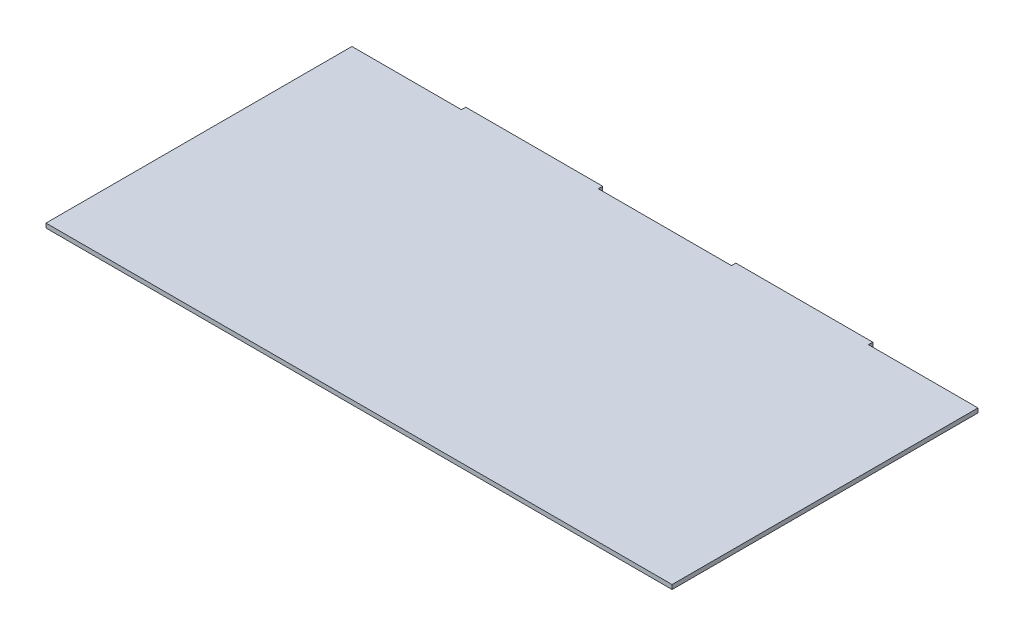
ISO-10303-21;
HEADER;
FILE_DESCRIPTION(('STEP AP214'),'2;1');
FILE_NAME('part.step','',(''),(''),'','','');
FILE_SCHEMA(('AUTOMOTIVE_DESIGN { 1 0 10303 214 1 1 1 1 }'));
ENDSEC;
DATA;
#1=APPLICATION_CONTEXT('core data for automotive mechanical design processes');
#2=APPLICATION_PROTOCOL_DEFINITION('international standard','automotive_design',2000,#1);
#3=PRODUCT_CONTEXT('',#1,'mechanical');
#4=PRODUCT('Part','Part','',(#3));
#5=PRODUCT_RELATED_PRODUCT_CATEGORY('part','',(#4));
#6=PRODUCT_DEFINITION_FORMATION('','',#4);
#7=PRODUCT_DEFINITION_CONTEXT('part definition',#1,'design');
#8=PRODUCT_DEFINITION('design','',#6,#7);
#9=PRODUCT_DEFINITION_SHAPE('','',#8);
#10=(LENGTH_UNIT() NAMED_UNIT(*) SI_UNIT(.MILLI.,.METRE.));
#11=(NAMED_UNIT(*) PLANE_ANGLE_UNIT() SI_UNIT($,.RADIAN.));
#12=(NAMED_UNIT(*) SI_UNIT($,.STERADIAN.) SOLID_ANGLE_UNIT());
#13=UNCERTAINTY_MEASURE_WITH_UNIT(LENGTH_MEASURE(1.E-05),#10,'distance_accuracy_value','');
#14=(GEOMETRIC_REPRESENTATION_CONTEXT(3) GLOBAL_UNCERTAINTY_ASSIGNED_CONTEXT((#13)) GLOBAL_UNIT_ASSIGNED_CONTEXT((#10,
#11,#12)) REPRESENTATION_CONTEXT('',''));
#15=CARTESIAN_POINT('',(0.,0.,0.));
#16=DIRECTION('',(0.,0.,1.));
#17=DIRECTION('',(1.,0.,0.));
#18=AXIS2_PLACEMENT_3D('',#15,#16,#17);
#19=CARTESIAN_POINT('',(0.,0.,0.));
#20=DIRECTION('',(0.,0.,-1.));
#21=DIRECTION('',(-1.,0.,0.));
#22=AXIS2_PLACEMENT_3D('',#19,#20,#21);
#23=PLANE('',#22);
#24=DIRECTION('',(1.,0.,0.));
#25=VECTOR('',#24,1.);
#26=CARTESIAN_POINT('',(-228.6,-1.5875,0.));
#27=LINE('',#26,#25);
#28=CARTESIAN_POINT('',(-48.623,-1.58749999999999,0.));
#29=VERTEX_POINT('',#28);
#30=CARTESIAN_POINT('',(48.5999999999999,-1.5875,0.));
#31=VERTEX_POINT('',#30);
#32=EDGE_CURVE('E147',#29,#31,#27,.T.);
#33=ORIENTED_EDGE('',*,*,#32,.F.);
#34=DIRECTION('',(0.,-1.,0.));
#35=VECTOR('',#34,1.);
#36=CARTESIAN_POINT('',(-48.623,1.58750000000005,0.));
#37=LINE('',#36,#35);
#38=CARTESIAN_POINT('',(-48.623,1.58750000000005,0.));
#39=VERTEX_POINT('',#38);
#40=EDGE_CURVE('E136',#39,#29,#37,.T.);
#41=ORIENTED_EDGE('',*,*,#40,.F.);
#42=DIRECTION('',(-1.,0.,0.));
#43=VECTOR('',#42,1.);
#44=CARTESIAN_POINT('',(-228.6,1.5875,0.));
#45=LINE('',#44,#43);
#46=CARTESIAN_POINT('',(48.6,1.58750000000005,0.));
#47=VERTEX_POINT('',#46);
#48=EDGE_CURVE('E145',#47,#39,#45,.T.);
#49=ORIENTED_EDGE('',*,*,#48,.F.);
#50=DIRECTION('',(0.,1.,0.));
#51=VECTOR('',#50,1.);
#52=CARTESIAN_POINT('',(48.6,1.58750000000005,0.));
#53=LINE('',#52,#51);
#54=EDGE_CURVE('E214',#31,#47,#53,.T.);
#55=ORIENTED_EDGE('',*,*,#54,.F.);
#56=EDGE_LOOP('',(#33,#41,#49,#55));
#57=FACE_BOUND('',#56,.T.);
#58=ADVANCED_FACE('F41',(#57),#23,.T.);
#59=CARTESIAN_POINT('',(-148.623,1.5875,0.));
#60=VERTEX_POINT('',#59);
#61=CARTESIAN_POINT('',(-228.6,1.5875,0.));
#62=VERTEX_POINT('',#61);
#63=EDGE_CURVE('E156',#60,#62,#45,.T.);
#64=ORIENTED_EDGE('',*,*,#63,.F.);
#65=DIRECTION('',(0.,1.,0.));
#66=VECTOR('',#65,1.);
#67=CARTESIAN_POINT('',(-148.623,1.58750000000005,0.));
#68=LINE('',#67,#66);
#69=CARTESIAN_POINT('',(-148.623,-1.58749999999999,0.));
#70=VERTEX_POINT('',#69);
#71=EDGE_CURVE('E148',#70,#60,#68,.T.);
#72=ORIENTED_EDGE('',*,*,#71,.F.);
#73=CARTESIAN_POINT('',(-228.6,-1.5875,0.));
#74=VERTEX_POINT('',#73);
#75=EDGE_CURVE('E165',#74,#70,#27,.T.);
#76=ORIENTED_EDGE('',*,*,#75,.F.);
#77=DIRECTION('',(0.,-1.,0.));
#78=VECTOR('',#77,1.);
#79=CARTESIAN_POINT('',(-228.6,-1.5875,0.));
#80=LINE('',#79,#78);
#81=EDGE_CURVE('E158',#62,#74,#80,.T.);
#82=ORIENTED_EDGE('',*,*,#81,.F.);
#83=EDGE_LOOP('',(#64,#72,#76,#82));
#84=FACE_BOUND('',#83,.T.);
#85=ADVANCED_FACE('F186',(#84),#23,.T.);
#86=DIRECTION('',(0.,-1.,0.));
#87=VECTOR('',#86,1.);
#88=CARTESIAN_POINT('',(148.6,1.58750000000005,0.));
#89=LINE('',#88,#87);
#90=CARTESIAN_POINT('',(148.6,1.5875,0.));
#91=VERTEX_POINT('',#90);
#92=CARTESIAN_POINT('',(148.6,-1.5875,0.));
#93=VERTEX_POINT('',#92);
#94=EDGE_CURVE('E64',#91,#93,#89,.T.);
#95=ORIENTED_EDGE('',*,*,#94,.F.);
#96=CARTESIAN_POINT('',(228.6,1.5875,0.));
#97=VERTEX_POINT('',#96);
#98=EDGE_CURVE('E155',#97,#91,#45,.T.);
#99=ORIENTED_EDGE('',*,*,#98,.F.);
#100=DIRECTION('',(0.,1.,0.));
#101=VECTOR('',#100,1.);
#102=CARTESIAN_POINT('',(228.6,-1.5875,0.));
#103=LINE('',#102,#101);
#104=CARTESIAN_POINT('',(228.6,-1.5875,0.));
#105=VERTEX_POINT('',#104);
#106=EDGE_CURVE('E159',#105,#97,#103,.T.);
#107=ORIENTED_EDGE('',*,*,#106,.F.);
#108=EDGE_CURVE('E164',#93,#105,#27,.T.);
#109=ORIENTED_EDGE('',*,*,#108,.F.);
#110=EDGE_LOOP('',(#95,#99,#107,#109));
#111=FACE_BOUND('',#110,.T.);
#112=ADVANCED_FACE('F251',(#111),#23,.T.);
#113=CARTESIAN_POINT('',(228.6,-1.5875,223.380000026));
#114=DIRECTION('',(-1.,0.,0.));
#115=DIRECTION('',(0.,0.,1.));
#116=AXIS2_PLACEMENT_3D('',#113,#114,#115);
#117=PLANE('',#116);
#118=ORIENTED_EDGE('',*,*,#106,.T.);
#119=DIRECTION('',(0.,0.,-1.));
#120=VECTOR('',#119,1.);
#121=CARTESIAN_POINT('',(228.6,1.5875,223.380000026));
#122=LINE('',#121,#120);
#123=CARTESIAN_POINT('',(228.6,1.5875,223.380000026));
#124=VERTEX_POINT('',#123);
#125=EDGE_CURVE('E11',#124,#97,#122,.T.);
#126=ORIENTED_EDGE('',*,*,#125,.F.);
#127=DIRECTION('',(0.,1.,0.));
#128=VECTOR('',#127,1.);
#129=CARTESIAN_POINT('',(228.6,-1.5875,223.380000026));
#130=LINE('',#129,#128);
#131=CARTESIAN_POINT('',(228.6,-1.5875,223.380000026));
#132=VERTEX_POINT('',#131);
#133=EDGE_CURVE('E168',#132,#124,#130,.T.);
#134=ORIENTED_EDGE('',*,*,#133,.F.);
#135=DIRECTION('',(0.,0.,-1.));
#136=VECTOR('',#135,1.);
#137=CARTESIAN_POINT('',(228.6,-1.5875,223.380000026));
#138=LINE('',#137,#136);
#139=EDGE_CURVE('E169',#132,#105,#138,.T.);
#140=ORIENTED_EDGE('',*,*,#139,.T.);
#141=EDGE_LOOP('',(#118,#126,#134,#140));
#142=FACE_BOUND('',#141,.T.);
#143=ADVANCED_FACE('F43',(#142),#117,.F.);
#144=CARTESIAN_POINT('',(-228.6,1.5875,223.380000026));
#145=DIRECTION('',(0.,-1.,0.));
#146=DIRECTION('',(0.,0.,-1.));
#147=AXIS2_PLACEMENT_3D('',#144,#145,#146);
#148=PLANE('',#147);
#149=ORIENTED_EDGE('',*,*,#98,.T.);
#150=DIRECTION('',(0.,0.,1.));
#151=VECTOR('',#150,1.);
#152=CARTESIAN_POINT('',(148.6,1.58750000000005,-3.175));
#153=LINE('',#152,#151);
#154=CARTESIAN_POINT('',(148.6,1.58750000000005,-3.175));
#155=VERTEX_POINT('',#154);
#156=EDGE_CURVE('E210',#155,#91,#153,.T.);
#157=ORIENTED_EDGE('',*,*,#156,.F.);
#158=DIRECTION('',(1.,0.,0.));
#159=VECTOR('',#158,1.);
#160=CARTESIAN_POINT('',(148.6,1.58750000000005,-3.175));
#161=LINE('',#160,#159);
#162=CARTESIAN_POINT('',(48.6,1.58750000000005,-3.175));
#163=VERTEX_POINT('',#162);
#164=EDGE_CURVE('E213',#163,#155,#161,.T.);
#165=ORIENTED_EDGE('',*,*,#164,.F.);
#166=DIRECTION('',(0.,0.,1.));
#167=VECTOR('',#166,1.);
#168=CARTESIAN_POINT('',(48.6,1.58750000000005,-3.175));
#169=LINE('',#168,#167);
#170=EDGE_CURVE('E154',#163,#47,#169,.T.);
#171=ORIENTED_EDGE('',*,*,#170,.T.);
#172=ORIENTED_EDGE('',*,*,#48,.T.);
#173=DIRECTION('',(0.,0.,1.));
#174=VECTOR('',#173,1.);
#175=CARTESIAN_POINT('',(-48.623,1.58750000000005,-3.175));
#176=LINE('',#175,#174);
#177=CARTESIAN_POINT('',(-48.623,1.58750000000005,-3.175));
#178=VERTEX_POINT('',#177);
#179=EDGE_CURVE('E132',#178,#39,#176,.T.);
#180=ORIENTED_EDGE('',*,*,#179,.F.);
#181=DIRECTION('',(1.,0.,0.));
#182=VECTOR('',#181,1.);
#183=CARTESIAN_POINT('',(-48.623,1.58750000000005,-3.175));
#184=LINE('',#183,#182);
#185=CARTESIAN_POINT('',(-148.623,1.58750000000005,-3.175));
#186=VERTEX_POINT('',#185);
#187=EDGE_CURVE('E141',#186,#178,#184,.T.);
#188=ORIENTED_EDGE('',*,*,#187,.F.);
#189=DIRECTION('',(0.,0.,1.));
#190=VECTOR('',#189,1.);
#191=CARTESIAN_POINT('',(-148.623,1.58750000000005,-3.175));
#192=LINE('',#191,#190);
#193=EDGE_CURVE('E56',#186,#60,#192,.T.);
#194=ORIENTED_EDGE('',*,*,#193,.T.);
#195=ORIENTED_EDGE('',*,*,#63,.T.);
#196=DIRECTION('',(0.,0.,-1.));
#197=VECTOR('',#196,1.);
#198=CARTESIAN_POINT('',(-228.6,1.5875,223.380000026));
#199=LINE('',#198,#197);
#200=CARTESIAN_POINT('',(-228.6,1.5875,223.380000026));
#201=VERTEX_POINT('',#200);
#202=EDGE_CURVE('E49',#201,#62,#199,.T.);
#203=ORIENTED_EDGE('',*,*,#202,.F.);
#204=DIRECTION('',(-1.,0.,0.));
#205=VECTOR('',#204,1.);
#206=CARTESIAN_POINT('',(-228.6,1.5875,223.380000026));
#207=LINE('',#206,#205);
#208=EDGE_CURVE('E198',#124,#201,#207,.T.);
#209=ORIENTED_EDGE('',*,*,#208,.F.);
#210=ORIENTED_EDGE('',*,*,#125,.T.);
#211=EDGE_LOOP('',(#149,#157,#165,#171,#172,#180,#188,#194,#195,#203,#209,#210));
#212=FACE_BOUND('',#211,.T.);
#213=ADVANCED_FACE('F151',(#212),#148,.F.);
#214=CARTESIAN_POINT('',(-228.6,-1.5875,223.380000026));
#215=DIRECTION('',(1.,0.,0.));
#216=DIRECTION('',(0.,0.,-1.));
#217=AXIS2_PLACEMENT_3D('',#214,#215,#216);
#218=PLANE('',#217);
#219=ORIENTED_EDGE('',*,*,#81,.T.);
#220=DIRECTION('',(0.,0.,-1.));
#221=VECTOR('',#220,1.);
#222=CARTESIAN_POINT('',(-228.6,-1.5875,223.380000026));
#223=LINE('',#222,#221);
#224=CARTESIAN_POINT('',(-228.6,-1.5875,223.380000026));
#225=VERTEX_POINT('',#224);
#226=EDGE_CURVE('E172',#225,#74,#223,.T.);
#227=ORIENTED_EDGE('',*,*,#226,.F.);
#228=DIRECTION('',(0.,-1.,0.));
#229=VECTOR('',#228,1.);
#230=CARTESIAN_POINT('',(-228.6,-1.5875,223.380000026));
#231=LINE('',#230,#229);
#232=EDGE_CURVE('E182',#201,#225,#231,.T.);
#233=ORIENTED_EDGE('',*,*,#232,.F.);
#234=ORIENTED_EDGE('',*,*,#202,.T.);
#235=EDGE_LOOP('',(#219,#227,#233,#234));
#236=FACE_BOUND('',#235,.T.);
#237=ADVANCED_FACE('F180',(#236),#218,.F.);
#238=CARTESIAN_POINT('',(-228.6,-1.5875,223.380000026));
#239=DIRECTION('',(0.,1.,0.));
#240=DIRECTION('',(0.,0.,1.));
#241=AXIS2_PLACEMENT_3D('',#238,#239,#240);
#242=PLANE('',#241);
#243=ORIENTED_EDGE('',*,*,#75,.T.);
#244=DIRECTION('',(0.,0.,1.));
#245=VECTOR('',#244,1.);
#246=CARTESIAN_POINT('',(-148.623,-1.58749999999999,-3.175));
#247=LINE('',#246,#245);
#248=CARTESIAN_POINT('',(-148.623,-1.58749999999999,-3.175));
#249=VERTEX_POINT('',#248);
#250=EDGE_CURVE('E191',#249,#70,#247,.T.);
#251=ORIENTED_EDGE('',*,*,#250,.F.);
#252=DIRECTION('',(-1.,0.,0.));
#253=VECTOR('',#252,1.);
#254=CARTESIAN_POINT('',(-48.623,-1.58749999999999,-3.175));
#255=LINE('',#254,#253);
#256=CARTESIAN_POINT('',(-48.623,-1.58749999999999,-3.175));
#257=VERTEX_POINT('',#256);
#258=EDGE_CURVE('E226',#257,#249,#255,.T.);
#259=ORIENTED_EDGE('',*,*,#258,.F.);
#260=DIRECTION('',(0.,0.,1.));
#261=VECTOR('',#260,1.);
#262=CARTESIAN_POINT('',(-48.623,-1.58749999999999,-3.175));
#263=LINE('',#262,#261);
#264=EDGE_CURVE('E234',#257,#29,#263,.T.);
#265=ORIENTED_EDGE('',*,*,#264,.T.);
#266=ORIENTED_EDGE('',*,*,#32,.T.);
#267=DIRECTION('',(0.,0.,1.));
#268=VECTOR('',#267,1.);
#269=CARTESIAN_POINT('',(48.6,-1.58749999999999,-3.175));
#270=LINE('',#269,#268);
#271=CARTESIAN_POINT('',(48.6,-1.58749999999999,-3.175));
#272=VERTEX_POINT('',#271);
#273=EDGE_CURVE('E206',#272,#31,#270,.T.);
#274=ORIENTED_EDGE('',*,*,#273,.F.);
#275=DIRECTION('',(-1.,0.,0.));
#276=VECTOR('',#275,1.);
#277=CARTESIAN_POINT('',(148.6,-1.58749999999999,-3.175));
#278=LINE('',#277,#276);
#279=CARTESIAN_POINT('',(148.6,-1.58749999999999,-3.175));
#280=VERTEX_POINT('',#279);
#281=EDGE_CURVE('E221',#280,#272,#278,.T.);
#282=ORIENTED_EDGE('',*,*,#281,.F.);
#283=DIRECTION('',(0.,0.,1.));
#284=VECTOR('',#283,1.);
#285=CARTESIAN_POINT('',(148.6,-1.58749999999999,-3.175));
#286=LINE('',#285,#284);
#287=EDGE_CURVE('E203',#280,#93,#286,.T.);
#288=ORIENTED_EDGE('',*,*,#287,.T.);
#289=ORIENTED_EDGE('',*,*,#108,.T.);
#290=ORIENTED_EDGE('',*,*,#139,.F.);
#291=DIRECTION('',(1.,0.,0.));
#292=VECTOR('',#291,1.);
#293=CARTESIAN_POINT('',(-228.6,-1.5875,223.380000026));
#294=LINE('',#293,#292);
#295=EDGE_CURVE('E173',#225,#132,#294,.T.);
#296=ORIENTED_EDGE('',*,*,#295,.F.);
#297=ORIENTED_EDGE('',*,*,#226,.T.);
#298=EDGE_LOOP('',(#243,#251,#259,#265,#266,#274,#282,#288,#289,#290,#296,#297));
#299=FACE_BOUND('',#298,.T.);
#300=ADVANCED_FACE('F190',(#299),#242,.F.);
#301=CARTESIAN_POINT('',(0.,0.,223.380000026));
#302=DIRECTION('',(0.,0.,-1.));
#303=DIRECTION('',(-1.,0.,0.));
#304=AXIS2_PLACEMENT_3D('',#301,#302,#303);
#305=PLANE('',#304);
#306=ORIENTED_EDGE('',*,*,#133,.T.);
#307=ORIENTED_EDGE('',*,*,#208,.T.);
#308=ORIENTED_EDGE('',*,*,#232,.T.);
#309=ORIENTED_EDGE('',*,*,#295,.T.);
#310=EDGE_LOOP('',(#306,#307,#308,#309));
#311=FACE_BOUND('',#310,.T.);
#312=ADVANCED_FACE('F271',(#311),#305,.F.);
#313=CARTESIAN_POINT('',(148.6,1.58750000000005,-3.175));
#314=DIRECTION('',(-1.,0.,0.));
#315=DIRECTION('',(0.,0.,1.));
#316=AXIS2_PLACEMENT_3D('',#313,#314,#315);
#317=PLANE('',#316);
#318=ORIENTED_EDGE('',*,*,#94,.T.);
#319=ORIENTED_EDGE('',*,*,#287,.F.);
#320=DIRECTION('',(0.,-1.,0.));
#321=VECTOR('',#320,1.);
#322=CARTESIAN_POINT('',(148.6,1.58750000000005,-3.175));
#323=LINE('',#322,#321);
#324=EDGE_CURVE('E216',#155,#280,#323,.T.);
#325=ORIENTED_EDGE('',*,*,#324,.F.);
#326=ORIENTED_EDGE('',*,*,#156,.T.);
#327=EDGE_LOOP('',(#318,#319,#325,#326));
#328=FACE_BOUND('',#327,.T.);
#329=ADVANCED_FACE('F272',(#328),#317,.F.);
#330=CARTESIAN_POINT('',(48.6,1.58750000000005,-3.175));
#331=DIRECTION('',(1.,0.,0.));
#332=DIRECTION('',(0.,0.,-1.));
#333=AXIS2_PLACEMENT_3D('',#330,#331,#332);
#334=PLANE('',#333);
#335=ORIENTED_EDGE('',*,*,#54,.T.);
#336=ORIENTED_EDGE('',*,*,#170,.F.);
#337=DIRECTION('',(0.,1.,0.));
#338=VECTOR('',#337,1.);
#339=CARTESIAN_POINT('',(48.6,1.58750000000005,-3.175));
#340=LINE('',#339,#338);
#341=EDGE_CURVE('E219',#272,#163,#340,.T.);
#342=ORIENTED_EDGE('',*,*,#341,.F.);
#343=ORIENTED_EDGE('',*,*,#273,.T.);
#344=EDGE_LOOP('',(#335,#336,#342,#343));
#345=FACE_BOUND('',#344,.T.);
#346=ADVANCED_FACE('F276',(#345),#334,.F.);
#347=CARTESIAN_POINT('',(0.,0.,-3.175));
#348=DIRECTION('',(0.,0.,-1.));
#349=DIRECTION('',(-1.,0.,0.));
#350=AXIS2_PLACEMENT_3D('',#347,#348,#349);
#351=PLANE('',#350);
#352=ORIENTED_EDGE('',*,*,#324,.T.);
#353=ORIENTED_EDGE('',*,*,#281,.T.);
#354=ORIENTED_EDGE('',*,*,#341,.T.);
#355=ORIENTED_EDGE('',*,*,#164,.T.);
#356=EDGE_LOOP('',(#352,#353,#354,#355));
#357=FACE_BOUND('',#356,.T.);
#358=ADVANCED_FACE('F247',(#357),#351,.T.);
#359=CARTESIAN_POINT('',(-48.623,1.58750000000005,-3.175));
#360=DIRECTION('',(-1.,0.,0.));
#361=DIRECTION('',(0.,0.,1.));
#362=AXIS2_PLACEMENT_3D('',#359,#360,#361);
#363=PLANE('',#362);
#364=ORIENTED_EDGE('',*,*,#40,.T.);
#365=ORIENTED_EDGE('',*,*,#264,.F.);
#366=DIRECTION('',(0.,-1.,0.));
#367=VECTOR('',#366,1.);
#368=CARTESIAN_POINT('',(-48.623,1.58750000000005,-3.175));
#369=LINE('',#368,#367);
#370=EDGE_CURVE('E139',#178,#257,#369,.T.);
#371=ORIENTED_EDGE('',*,*,#370,.F.);
#372=ORIENTED_EDGE('',*,*,#179,.T.);
#373=EDGE_LOOP('',(#364,#365,#371,#372));
#374=FACE_BOUND('',#373,.T.);
#375=ADVANCED_FACE('F134',(#374),#363,.F.);
#376=CARTESIAN_POINT('',(-148.623,1.58750000000005,-3.175));
#377=DIRECTION('',(1.,0.,0.));
#378=DIRECTION('',(0.,0.,-1.));
#379=AXIS2_PLACEMENT_3D('',#376,#377,#378);
#380=PLANE('',#379);
#381=ORIENTED_EDGE('',*,*,#71,.T.);
#382=ORIENTED_EDGE('',*,*,#193,.F.);
#383=DIRECTION('',(0.,1.,0.));
#384=VECTOR('',#383,1.);
#385=CARTESIAN_POINT('',(-148.623,1.58750000000005,-3.175));
#386=LINE('',#385,#384);
#387=EDGE_CURVE('E228',#249,#186,#386,.T.);
#388=ORIENTED_EDGE('',*,*,#387,.F.);
#389=ORIENTED_EDGE('',*,*,#250,.T.);
#390=EDGE_LOOP('',(#381,#382,#388,#389));
#391=FACE_BOUND('',#390,.T.);
#392=ADVANCED_FACE('F239',(#391),#380,.F.);
#393=CARTESIAN_POINT('',(0.,0.,-3.175));
#394=DIRECTION('',(0.,0.,-1.));
#395=DIRECTION('',(-1.,0.,0.));
#396=AXIS2_PLACEMENT_3D('',#393,#394,#395);
#397=PLANE('',#396);
#398=ORIENTED_EDGE('',*,*,#370,.T.);
#399=ORIENTED_EDGE('',*,*,#258,.T.);
#400=ORIENTED_EDGE('',*,*,#387,.T.);
#401=ORIENTED_EDGE('',*,*,#187,.T.);
#402=EDGE_LOOP('',(#398,#399,#400,#401));
#403=FACE_BOUND('',#402,.T.);
#404=ADVANCED_FACE('F237',(#403),#397,.T.);
#405=CLOSED_SHELL('',(#58,#85,#112,#143,#213,#237,#300,#312,#329,#346,#358,#375,#392,#404));
#406=MANIFOLD_SOLID_BREP('B2',#405);
#407=ADVANCED_BREP_SHAPE_REPRESENTATION('',(#18,#406),#14);
#408=SHAPE_DEFINITION_REPRESENTATION(#9,#407);
ENDSEC;
END-ISO-10303-21;
